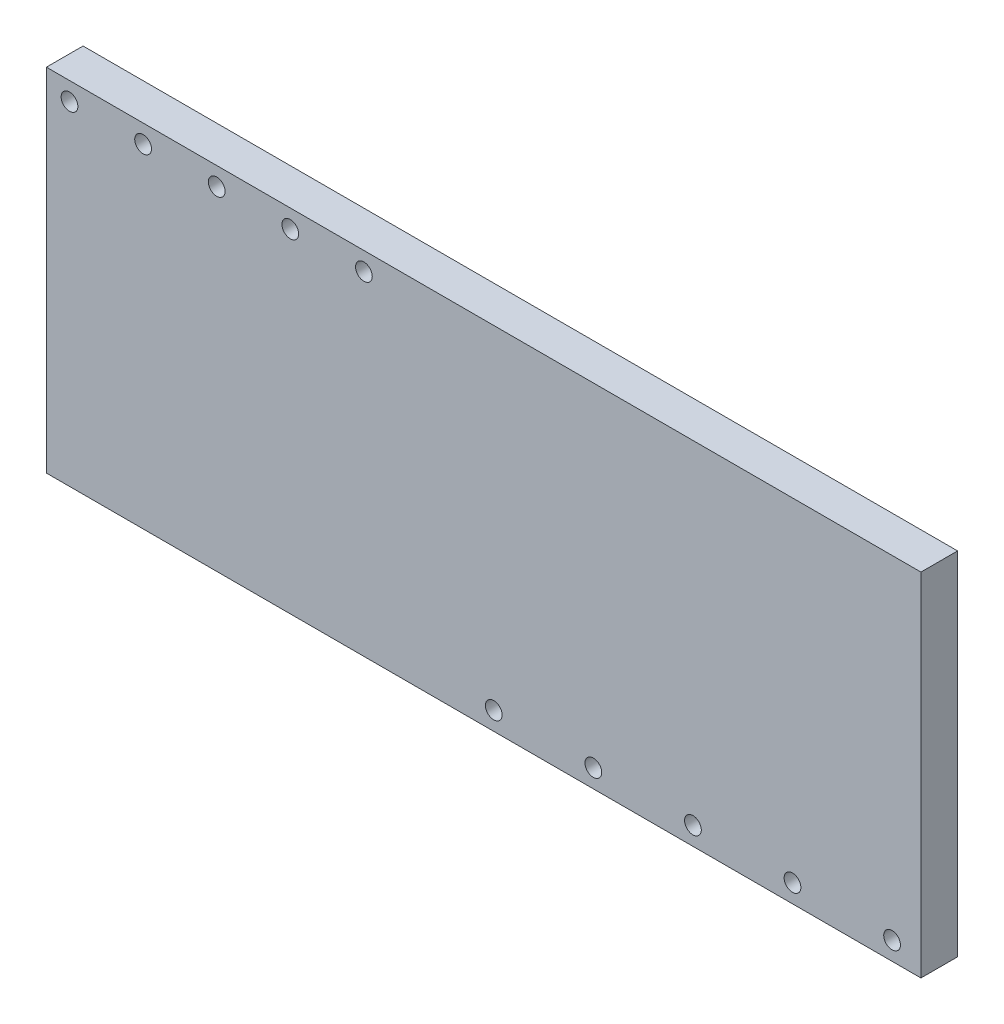
ISO-10303-21;
HEADER;
FILE_DESCRIPTION(('STEP AP214'),'2;1');
FILE_NAME('part.step','',(''),(''),'','','');
FILE_SCHEMA(('AUTOMOTIVE_DESIGN { 1 0 10303 214 1 1 1 1 }'));
ENDSEC;
DATA;
#1=APPLICATION_CONTEXT('core data for automotive mechanical design processes');
#2=APPLICATION_PROTOCOL_DEFINITION('international standard','automotive_design',2000,#1);
#3=PRODUCT_CONTEXT('',#1,'mechanical');
#4=PRODUCT('Part','Part','',(#3));
#5=PRODUCT_RELATED_PRODUCT_CATEGORY('part','',(#4));
#6=PRODUCT_DEFINITION_FORMATION('','',#4);
#7=PRODUCT_DEFINITION_CONTEXT('part definition',#1,'design');
#8=PRODUCT_DEFINITION('design','',#6,#7);
#9=PRODUCT_DEFINITION_SHAPE('','',#8);
#10=(LENGTH_UNIT() NAMED_UNIT(*) SI_UNIT(.MILLI.,.METRE.));
#11=(NAMED_UNIT(*) PLANE_ANGLE_UNIT() SI_UNIT($,.RADIAN.));
#12=(NAMED_UNIT(*) SI_UNIT($,.STERADIAN.) SOLID_ANGLE_UNIT());
#13=UNCERTAINTY_MEASURE_WITH_UNIT(LENGTH_MEASURE(1.E-05),#10,'distance_accuracy_value','');
#14=(GEOMETRIC_REPRESENTATION_CONTEXT(3) GLOBAL_UNCERTAINTY_ASSIGNED_CONTEXT((#13)) GLOBAL_UNIT_ASSIGNED_CONTEXT((#10,
#11,#12)) REPRESENTATION_CONTEXT('',''));
#15=CARTESIAN_POINT('',(0.,0.,0.));
#16=DIRECTION('',(0.,0.,1.));
#17=DIRECTION('',(1.,0.,0.));
#18=AXIS2_PLACEMENT_3D('',#15,#16,#17);
#19=CARTESIAN_POINT('',(75.750000011,30.45,6.35));
#20=DIRECTION('',(-1.,0.,0.));
#21=DIRECTION('',(0.,-1.,0.));
#22=AXIS2_PLACEMENT_3D('',#19,#20,#21);
#23=PLANE('',#22);
#24=DIRECTION('',(0.,1.,0.));
#25=VECTOR('',#24,1.);
#26=CARTESIAN_POINT('',(75.750000011,30.45,0.));
#27=LINE('',#26,#25);
#28=CARTESIAN_POINT('',(75.750000011,-30.45,0.));
#29=VERTEX_POINT('',#28);
#30=CARTESIAN_POINT('',(75.750000011,30.45,0.));
#31=VERTEX_POINT('',#30);
#32=EDGE_CURVE('E97',#29,#31,#27,.T.);
#33=ORIENTED_EDGE('',*,*,#32,.T.);
#34=DIRECTION('',(0.,0.,-1.));
#35=VECTOR('',#34,1.);
#36=CARTESIAN_POINT('',(75.750000011,30.45,6.35));
#37=LINE('',#36,#35);
#38=CARTESIAN_POINT('',(75.750000011,30.45,6.35));
#39=VERTEX_POINT('',#38);
#40=EDGE_CURVE('E11',#39,#31,#37,.T.);
#41=ORIENTED_EDGE('',*,*,#40,.F.);
#42=DIRECTION('',(0.,1.,0.));
#43=VECTOR('',#42,1.);
#44=CARTESIAN_POINT('',(75.750000011,30.45,6.35));
#45=LINE('',#44,#43);
#46=CARTESIAN_POINT('',(75.750000011,-30.45,6.35));
#47=VERTEX_POINT('',#46);
#48=EDGE_CURVE('E85',#47,#39,#45,.T.);
#49=ORIENTED_EDGE('',*,*,#48,.F.);
#50=DIRECTION('',(0.,0.,-1.));
#51=VECTOR('',#50,1.);
#52=CARTESIAN_POINT('',(75.750000011,-30.45,6.35));
#53=LINE('',#52,#51);
#54=EDGE_CURVE('E93',#47,#29,#53,.T.);
#55=ORIENTED_EDGE('',*,*,#54,.T.);
#56=EDGE_LOOP('',(#33,#41,#49,#55));
#57=FACE_BOUND('',#56,.T.);
#58=ADVANCED_FACE('F34',(#57),#23,.F.);
#59=CARTESIAN_POINT('',(-75.750000011,30.45,6.35));
#60=DIRECTION('',(0.,-1.,0.));
#61=DIRECTION('',(0.,0.,-1.));
#62=AXIS2_PLACEMENT_3D('',#59,#60,#61);
#63=PLANE('',#62);
#64=DIRECTION('',(-1.,0.,0.));
#65=VECTOR('',#64,1.);
#66=CARTESIAN_POINT('',(-75.750000011,30.45,0.));
#67=LINE('',#66,#65);
#68=CARTESIAN_POINT('',(-75.750000011,30.45,0.));
#69=VERTEX_POINT('',#68);
#70=EDGE_CURVE('E89',#31,#69,#67,.T.);
#71=ORIENTED_EDGE('',*,*,#70,.T.);
#72=DIRECTION('',(0.,0.,-1.));
#73=VECTOR('',#72,1.);
#74=CARTESIAN_POINT('',(-75.750000011,30.45,6.35));
#75=LINE('',#74,#73);
#76=CARTESIAN_POINT('',(-75.750000011,30.45,6.35));
#77=VERTEX_POINT('',#76);
#78=EDGE_CURVE('E42',#77,#69,#75,.T.);
#79=ORIENTED_EDGE('',*,*,#78,.F.);
#80=DIRECTION('',(-1.,0.,0.));
#81=VECTOR('',#80,1.);
#82=CARTESIAN_POINT('',(-75.750000011,30.45,6.35));
#83=LINE('',#82,#81);
#84=EDGE_CURVE('E80',#39,#77,#83,.T.);
#85=ORIENTED_EDGE('',*,*,#84,.F.);
#86=ORIENTED_EDGE('',*,*,#40,.T.);
#87=EDGE_LOOP('',(#71,#79,#85,#86));
#88=FACE_BOUND('',#87,.T.);
#89=ADVANCED_FACE('F88',(#88),#63,.F.);
#90=CARTESIAN_POINT('',(-75.750000011,30.45,6.35));
#91=DIRECTION('',(1.,0.,0.));
#92=DIRECTION('',(0.,1.,0.));
#93=AXIS2_PLACEMENT_3D('',#90,#91,#92);
#94=PLANE('',#93);
#95=DIRECTION('',(0.,-1.,0.));
#96=VECTOR('',#95,1.);
#97=CARTESIAN_POINT('',(-75.750000011,30.45,0.));
#98=LINE('',#97,#96);
#99=CARTESIAN_POINT('',(-75.750000011,-30.45,0.));
#100=VERTEX_POINT('',#99);
#101=EDGE_CURVE('E67',#69,#100,#98,.T.);
#102=ORIENTED_EDGE('',*,*,#101,.T.);
#103=DIRECTION('',(0.,0.,-1.));
#104=VECTOR('',#103,1.);
#105=CARTESIAN_POINT('',(-75.750000011,-30.45,6.35));
#106=LINE('',#105,#104);
#107=CARTESIAN_POINT('',(-75.750000011,-30.45,6.35));
#108=VERTEX_POINT('',#107);
#109=EDGE_CURVE('E90',#108,#100,#106,.T.);
#110=ORIENTED_EDGE('',*,*,#109,.F.);
#111=DIRECTION('',(0.,-1.,0.));
#112=VECTOR('',#111,1.);
#113=CARTESIAN_POINT('',(-75.750000011,30.45,6.35));
#114=LINE('',#113,#112);
#115=EDGE_CURVE('E83',#77,#108,#114,.T.);
#116=ORIENTED_EDGE('',*,*,#115,.F.);
#117=ORIENTED_EDGE('',*,*,#78,.T.);
#118=EDGE_LOOP('',(#102,#110,#116,#117));
#119=FACE_BOUND('',#118,.T.);
#120=ADVANCED_FACE('F91',(#119),#94,.F.);
#121=CARTESIAN_POINT('',(-75.750000011,-30.45,6.35));
#122=DIRECTION('',(0.,1.,0.));
#123=DIRECTION('',(0.,0.,1.));
#124=AXIS2_PLACEMENT_3D('',#121,#122,#123);
#125=PLANE('',#124);
#126=DIRECTION('',(1.,0.,0.));
#127=VECTOR('',#126,1.);
#128=CARTESIAN_POINT('',(-75.750000011,-30.45,0.));
#129=LINE('',#128,#127);
#130=EDGE_CURVE('E73',#100,#29,#129,.T.);
#131=ORIENTED_EDGE('',*,*,#130,.T.);
#132=ORIENTED_EDGE('',*,*,#54,.F.);
#133=DIRECTION('',(1.,0.,0.));
#134=VECTOR('',#133,1.);
#135=CARTESIAN_POINT('',(-75.750000011,-30.45,6.35));
#136=LINE('',#135,#134);
#137=EDGE_CURVE('E50',#108,#47,#136,.T.);
#138=ORIENTED_EDGE('',*,*,#137,.F.);
#139=ORIENTED_EDGE('',*,*,#109,.T.);
#140=EDGE_LOOP('',(#131,#132,#138,#139));
#141=FACE_BOUND('',#140,.T.);
#142=ADVANCED_FACE('F105',(#141),#125,.F.);
#143=CARTESIAN_POINT('',(0.,0.,6.35));
#144=DIRECTION('',(0.,0.,1.));
#145=DIRECTION('',(1.,0.,0.));
#146=AXIS2_PLACEMENT_3D('',#143,#144,#145);
#147=PLANE('',#146);
#148=CARTESIAN_POINT('',(-71.750000011,27.275,6.35));
#149=DIRECTION('',(0.,0.,1.));
#150=DIRECTION('',(1.,0.,0.));
#151=AXIS2_PLACEMENT_3D('',#148,#149,#150);
#152=CIRCLE('',#151,1.44999999999999);
#153=CARTESIAN_POINT('',(-70.300000011,27.275,6.35));
#154=VERTEX_POINT('',#153);
#155=EDGE_CURVE('E167',#154,#154,#152,.T.);
#156=ORIENTED_EDGE('',*,*,#155,.F.);
#157=EDGE_LOOP('',(#156));
#158=FACE_BOUND('',#157,.T.);
#159=CARTESIAN_POINT('',(-59.000000011,27.275,6.35));
#160=DIRECTION('',(0.,0.,1.));
#161=DIRECTION('',(1.,0.,0.));
#162=AXIS2_PLACEMENT_3D('',#159,#160,#161);
#163=CIRCLE('',#162,1.45);
#164=CARTESIAN_POINT('',(-57.550000011,27.275,6.35));
#165=VERTEX_POINT('',#164);
#166=EDGE_CURVE('E161',#165,#165,#163,.T.);
#167=ORIENTED_EDGE('',*,*,#166,.F.);
#168=EDGE_LOOP('',(#167));
#169=FACE_BOUND('',#168,.T.);
#170=CARTESIAN_POINT('',(-46.250000011,27.275,6.35));
#171=DIRECTION('',(0.,0.,1.));
#172=DIRECTION('',(1.,0.,0.));
#173=AXIS2_PLACEMENT_3D('',#170,#171,#172);
#174=CIRCLE('',#173,1.45);
#175=CARTESIAN_POINT('',(-44.800000011,27.275,6.35));
#176=VERTEX_POINT('',#175);
#177=EDGE_CURVE('E155',#176,#176,#174,.T.);
#178=ORIENTED_EDGE('',*,*,#177,.F.);
#179=EDGE_LOOP('',(#178));
#180=FACE_BOUND('',#179,.T.);
#181=CARTESIAN_POINT('',(-33.500000011,27.275,6.35));
#182=DIRECTION('',(0.,0.,1.));
#183=DIRECTION('',(1.,0.,0.));
#184=AXIS2_PLACEMENT_3D('',#181,#182,#183);
#185=CIRCLE('',#184,1.45);
#186=CARTESIAN_POINT('',(-32.050000011,27.275,6.35));
#187=VERTEX_POINT('',#186);
#188=EDGE_CURVE('E149',#187,#187,#185,.T.);
#189=ORIENTED_EDGE('',*,*,#188,.F.);
#190=EDGE_LOOP('',(#189));
#191=FACE_BOUND('',#190,.T.);
#192=CARTESIAN_POINT('',(-20.750000011,27.275,6.35));
#193=DIRECTION('',(0.,0.,1.));
#194=DIRECTION('',(1.,0.,0.));
#195=AXIS2_PLACEMENT_3D('',#192,#193,#194);
#196=CIRCLE('',#195,1.45);
#197=CARTESIAN_POINT('',(-19.300000011,27.275,6.35));
#198=VERTEX_POINT('',#197);
#199=EDGE_CURVE('E143',#198,#198,#196,.T.);
#200=ORIENTED_EDGE('',*,*,#199,.F.);
#201=EDGE_LOOP('',(#200));
#202=FACE_BOUND('',#201,.T.);
#203=CARTESIAN_POINT('',(1.75000115605144,-27.2749999999997,6.35));
#204=DIRECTION('',(0.,0.,1.));
#205=DIRECTION('',(1.,0.,0.));
#206=AXIS2_PLACEMENT_3D('',#203,#204,#205);
#207=CIRCLE('',#206,1.45);
#208=CARTESIAN_POINT('',(3.20000115605144,-27.2749999999997,6.35));
#209=VERTEX_POINT('',#208);
#210=EDGE_CURVE('E137',#209,#209,#207,.T.);
#211=ORIENTED_EDGE('',*,*,#210,.F.);
#212=EDGE_LOOP('',(#211));
#213=FACE_BOUND('',#212,.T.);
#214=CARTESIAN_POINT('',(19.000000864289,-27.2749999999997,6.35));
#215=DIRECTION('',(0.,0.,1.));
#216=DIRECTION('',(1.,0.,0.));
#217=AXIS2_PLACEMENT_3D('',#214,#215,#216);
#218=CIRCLE('',#217,1.45);
#219=CARTESIAN_POINT('',(20.450000864289,-27.2749999999997,6.35));
#220=VERTEX_POINT('',#219);
#221=EDGE_CURVE('E131',#220,#220,#218,.T.);
#222=ORIENTED_EDGE('',*,*,#221,.F.);
#223=EDGE_LOOP('',(#222));
#224=FACE_BOUND('',#223,.T.);
#225=CARTESIAN_POINT('',(36.2500005725266,-27.2749999999997,6.35));
#226=DIRECTION('',(0.,0.,1.));
#227=DIRECTION('',(1.,0.,0.));
#228=AXIS2_PLACEMENT_3D('',#225,#226,#227);
#229=CIRCLE('',#228,1.45);
#230=CARTESIAN_POINT('',(37.7000005725266,-27.2749999999997,6.35));
#231=VERTEX_POINT('',#230);
#232=EDGE_CURVE('E125',#231,#231,#229,.T.);
#233=ORIENTED_EDGE('',*,*,#232,.F.);
#234=EDGE_LOOP('',(#233));
#235=FACE_BOUND('',#234,.T.);
#236=CARTESIAN_POINT('',(53.5000002807642,-27.2749999999997,6.35));
#237=DIRECTION('',(0.,0.,1.));
#238=DIRECTION('',(1.,0.,0.));
#239=AXIS2_PLACEMENT_3D('',#236,#237,#238);
#240=CIRCLE('',#239,1.45);
#241=CARTESIAN_POINT('',(54.9500002807642,-27.2749999999997,6.35));
#242=VERTEX_POINT('',#241);
#243=EDGE_CURVE('E119',#242,#242,#240,.T.);
#244=ORIENTED_EDGE('',*,*,#243,.F.);
#245=EDGE_LOOP('',(#244));
#246=FACE_BOUND('',#245,.T.);
#247=CARTESIAN_POINT('',(70.7499999890018,-27.2749999999997,6.35));
#248=DIRECTION('',(0.,0.,1.));
#249=DIRECTION('',(1.,0.,0.));
#250=AXIS2_PLACEMENT_3D('',#247,#248,#249);
#251=CIRCLE('',#250,1.44999999999999);
#252=CARTESIAN_POINT('',(72.1999999890018,-27.2749999999997,6.35));
#253=VERTEX_POINT('',#252);
#254=EDGE_CURVE('E113',#253,#253,#251,.T.);
#255=ORIENTED_EDGE('',*,*,#254,.F.);
#256=EDGE_LOOP('',(#255));
#257=FACE_BOUND('',#256,.T.);
#258=ORIENTED_EDGE('',*,*,#48,.T.);
#259=ORIENTED_EDGE('',*,*,#84,.T.);
#260=ORIENTED_EDGE('',*,*,#115,.T.);
#261=ORIENTED_EDGE('',*,*,#137,.T.);
#262=EDGE_LOOP('',(#258,#259,#260,#261));
#263=FACE_BOUND('',#262,.T.);
#264=ADVANCED_FACE('F81',(#158,#169,#180,#191,#202,#213,#224,#235,#246,#257,#263),#147,.T.);
#265=CARTESIAN_POINT('',(0.,0.,0.));
#266=DIRECTION('',(0.,0.,1.));
#267=DIRECTION('',(1.,0.,0.));
#268=AXIS2_PLACEMENT_3D('',#265,#266,#267);
#269=PLANE('',#268);
#270=CARTESIAN_POINT('',(-71.750000011,27.275,0.));
#271=DIRECTION('',(0.,0.,1.));
#272=DIRECTION('',(1.,0.,0.));
#273=AXIS2_PLACEMENT_3D('',#270,#271,#272);
#274=CIRCLE('',#273,1.44999999999999);
#275=CARTESIAN_POINT('',(-70.300000011,27.275,0.));
#276=VERTEX_POINT('',#275);
#277=EDGE_CURVE('E164',#276,#276,#274,.T.);
#278=ORIENTED_EDGE('',*,*,#277,.T.);
#279=EDGE_LOOP('',(#278));
#280=FACE_BOUND('',#279,.T.);
#281=CARTESIAN_POINT('',(-59.000000011,27.275,0.));
#282=DIRECTION('',(0.,0.,1.));
#283=DIRECTION('',(1.,0.,0.));
#284=AXIS2_PLACEMENT_3D('',#281,#282,#283);
#285=CIRCLE('',#284,1.45);
#286=CARTESIAN_POINT('',(-57.550000011,27.275,0.));
#287=VERTEX_POINT('',#286);
#288=EDGE_CURVE('E158',#287,#287,#285,.T.);
#289=ORIENTED_EDGE('',*,*,#288,.T.);
#290=EDGE_LOOP('',(#289));
#291=FACE_BOUND('',#290,.T.);
#292=CARTESIAN_POINT('',(-46.250000011,27.275,0.));
#293=DIRECTION('',(0.,0.,1.));
#294=DIRECTION('',(1.,0.,0.));
#295=AXIS2_PLACEMENT_3D('',#292,#293,#294);
#296=CIRCLE('',#295,1.45);
#297=CARTESIAN_POINT('',(-44.800000011,27.275,0.));
#298=VERTEX_POINT('',#297);
#299=EDGE_CURVE('E152',#298,#298,#296,.T.);
#300=ORIENTED_EDGE('',*,*,#299,.T.);
#301=EDGE_LOOP('',(#300));
#302=FACE_BOUND('',#301,.T.);
#303=CARTESIAN_POINT('',(-33.500000011,27.275,0.));
#304=DIRECTION('',(0.,0.,1.));
#305=DIRECTION('',(1.,0.,0.));
#306=AXIS2_PLACEMENT_3D('',#303,#304,#305);
#307=CIRCLE('',#306,1.45);
#308=CARTESIAN_POINT('',(-32.050000011,27.275,0.));
#309=VERTEX_POINT('',#308);
#310=EDGE_CURVE('E146',#309,#309,#307,.T.);
#311=ORIENTED_EDGE('',*,*,#310,.T.);
#312=EDGE_LOOP('',(#311));
#313=FACE_BOUND('',#312,.T.);
#314=CARTESIAN_POINT('',(-20.750000011,27.275,0.));
#315=DIRECTION('',(0.,0.,1.));
#316=DIRECTION('',(1.,0.,0.));
#317=AXIS2_PLACEMENT_3D('',#314,#315,#316);
#318=CIRCLE('',#317,1.45);
#319=CARTESIAN_POINT('',(-19.300000011,27.275,0.));
#320=VERTEX_POINT('',#319);
#321=EDGE_CURVE('E140',#320,#320,#318,.T.);
#322=ORIENTED_EDGE('',*,*,#321,.T.);
#323=EDGE_LOOP('',(#322));
#324=FACE_BOUND('',#323,.T.);
#325=CARTESIAN_POINT('',(1.75000115605144,-27.2749999999997,0.));
#326=DIRECTION('',(0.,0.,1.));
#327=DIRECTION('',(1.,0.,0.));
#328=AXIS2_PLACEMENT_3D('',#325,#326,#327);
#329=CIRCLE('',#328,1.45);
#330=CARTESIAN_POINT('',(3.20000115605144,-27.2749999999997,0.));
#331=VERTEX_POINT('',#330);
#332=EDGE_CURVE('E134',#331,#331,#329,.T.);
#333=ORIENTED_EDGE('',*,*,#332,.T.);
#334=EDGE_LOOP('',(#333));
#335=FACE_BOUND('',#334,.T.);
#336=CARTESIAN_POINT('',(19.000000864289,-27.2749999999997,0.));
#337=DIRECTION('',(0.,0.,1.));
#338=DIRECTION('',(1.,0.,0.));
#339=AXIS2_PLACEMENT_3D('',#336,#337,#338);
#340=CIRCLE('',#339,1.45);
#341=CARTESIAN_POINT('',(20.450000864289,-27.2749999999997,0.));
#342=VERTEX_POINT('',#341);
#343=EDGE_CURVE('E128',#342,#342,#340,.T.);
#344=ORIENTED_EDGE('',*,*,#343,.T.);
#345=EDGE_LOOP('',(#344));
#346=FACE_BOUND('',#345,.T.);
#347=CARTESIAN_POINT('',(36.2500005725266,-27.2749999999997,0.));
#348=DIRECTION('',(0.,0.,1.));
#349=DIRECTION('',(1.,0.,0.));
#350=AXIS2_PLACEMENT_3D('',#347,#348,#349);
#351=CIRCLE('',#350,1.45);
#352=CARTESIAN_POINT('',(37.7000005725266,-27.2749999999997,0.));
#353=VERTEX_POINT('',#352);
#354=EDGE_CURVE('E122',#353,#353,#351,.T.);
#355=ORIENTED_EDGE('',*,*,#354,.T.);
#356=EDGE_LOOP('',(#355));
#357=FACE_BOUND('',#356,.T.);
#358=CARTESIAN_POINT('',(53.5000002807642,-27.2749999999997,0.));
#359=DIRECTION('',(0.,0.,1.));
#360=DIRECTION('',(1.,0.,0.));
#361=AXIS2_PLACEMENT_3D('',#358,#359,#360);
#362=CIRCLE('',#361,1.45);
#363=CARTESIAN_POINT('',(54.9500002807642,-27.2749999999997,0.));
#364=VERTEX_POINT('',#363);
#365=EDGE_CURVE('E116',#364,#364,#362,.T.);
#366=ORIENTED_EDGE('',*,*,#365,.T.);
#367=EDGE_LOOP('',(#366));
#368=FACE_BOUND('',#367,.T.);
#369=CARTESIAN_POINT('',(70.7499999890018,-27.2749999999997,0.));
#370=DIRECTION('',(0.,0.,1.));
#371=DIRECTION('',(1.,0.,0.));
#372=AXIS2_PLACEMENT_3D('',#369,#370,#371);
#373=CIRCLE('',#372,1.44999999999999);
#374=CARTESIAN_POINT('',(72.1999999890018,-27.2749999999997,0.));
#375=VERTEX_POINT('',#374);
#376=EDGE_CURVE('E100',#375,#375,#373,.T.);
#377=ORIENTED_EDGE('',*,*,#376,.T.);
#378=EDGE_LOOP('',(#377));
#379=FACE_BOUND('',#378,.T.);
#380=ORIENTED_EDGE('',*,*,#32,.F.);
#381=ORIENTED_EDGE('',*,*,#130,.F.);
#382=ORIENTED_EDGE('',*,*,#101,.F.);
#383=ORIENTED_EDGE('',*,*,#70,.F.);
#384=EDGE_LOOP('',(#380,#381,#382,#383));
#385=FACE_BOUND('',#384,.T.);
#386=ADVANCED_FACE('F108',(#280,#291,#302,#313,#324,#335,#346,#357,#368,#379,#385),#269,.F.);
#387=CARTESIAN_POINT('',(70.7499999890018,-27.2749999999997,6.35));
#388=DIRECTION('',(0.,0.,1.));
#389=DIRECTION('',(1.,0.,0.));
#390=AXIS2_PLACEMENT_3D('',#387,#388,#389);
#391=CYLINDRICAL_SURFACE('',#390,1.44999999999999);
#392=ORIENTED_EDGE('',*,*,#376,.F.);
#393=EDGE_LOOP('',(#392));
#394=FACE_BOUND('',#393,.T.);
#395=ORIENTED_EDGE('',*,*,#254,.T.);
#396=EDGE_LOOP('',(#395));
#397=FACE_BOUND('',#396,.T.);
#398=ADVANCED_FACE('F194',(#394,#397),#391,.F.);
#399=CARTESIAN_POINT('',(53.5000002807642,-27.2749999999997,6.35));
#400=DIRECTION('',(0.,0.,1.));
#401=DIRECTION('',(1.,0.,0.));
#402=AXIS2_PLACEMENT_3D('',#399,#400,#401);
#403=CYLINDRICAL_SURFACE('',#402,1.45);
#404=ORIENTED_EDGE('',*,*,#365,.F.);
#405=EDGE_LOOP('',(#404));
#406=FACE_BOUND('',#405,.T.);
#407=ORIENTED_EDGE('',*,*,#243,.T.);
#408=EDGE_LOOP('',(#407));
#409=FACE_BOUND('',#408,.T.);
#410=ADVANCED_FACE('F196',(#406,#409),#403,.F.);
#411=CARTESIAN_POINT('',(36.2500005725266,-27.2749999999997,6.35));
#412=DIRECTION('',(0.,0.,1.));
#413=DIRECTION('',(1.,0.,0.));
#414=AXIS2_PLACEMENT_3D('',#411,#412,#413);
#415=CYLINDRICAL_SURFACE('',#414,1.45);
#416=ORIENTED_EDGE('',*,*,#354,.F.);
#417=EDGE_LOOP('',(#416));
#418=FACE_BOUND('',#417,.T.);
#419=ORIENTED_EDGE('',*,*,#232,.T.);
#420=EDGE_LOOP('',(#419));
#421=FACE_BOUND('',#420,.T.);
#422=ADVANCED_FACE('F203',(#418,#421),#415,.F.);
#423=CARTESIAN_POINT('',(19.000000864289,-27.2749999999997,6.35));
#424=DIRECTION('',(0.,0.,1.));
#425=DIRECTION('',(1.,0.,0.));
#426=AXIS2_PLACEMENT_3D('',#423,#424,#425);
#427=CYLINDRICAL_SURFACE('',#426,1.45);
#428=ORIENTED_EDGE('',*,*,#343,.F.);
#429=EDGE_LOOP('',(#428));
#430=FACE_BOUND('',#429,.T.);
#431=ORIENTED_EDGE('',*,*,#221,.T.);
#432=EDGE_LOOP('',(#431));
#433=FACE_BOUND('',#432,.T.);
#434=ADVANCED_FACE('F250',(#430,#433),#427,.F.);
#435=CARTESIAN_POINT('',(1.75000115605144,-27.2749999999997,6.35));
#436=DIRECTION('',(0.,0.,1.));
#437=DIRECTION('',(1.,0.,0.));
#438=AXIS2_PLACEMENT_3D('',#435,#436,#437);
#439=CYLINDRICAL_SURFACE('',#438,1.45);
#440=ORIENTED_EDGE('',*,*,#332,.F.);
#441=EDGE_LOOP('',(#440));
#442=FACE_BOUND('',#441,.T.);
#443=ORIENTED_EDGE('',*,*,#210,.T.);
#444=EDGE_LOOP('',(#443));
#445=FACE_BOUND('',#444,.T.);
#446=ADVANCED_FACE('F260',(#442,#445),#439,.F.);
#447=CARTESIAN_POINT('',(-20.750000011,27.275,6.35));
#448=DIRECTION('',(0.,0.,1.));
#449=DIRECTION('',(1.,0.,0.));
#450=AXIS2_PLACEMENT_3D('',#447,#448,#449);
#451=CYLINDRICAL_SURFACE('',#450,1.45);
#452=ORIENTED_EDGE('',*,*,#321,.F.);
#453=EDGE_LOOP('',(#452));
#454=FACE_BOUND('',#453,.T.);
#455=ORIENTED_EDGE('',*,*,#199,.T.);
#456=EDGE_LOOP('',(#455));
#457=FACE_BOUND('',#456,.T.);
#458=ADVANCED_FACE('F270',(#454,#457),#451,.F.);
#459=CARTESIAN_POINT('',(-33.500000011,27.275,6.35));
#460=DIRECTION('',(0.,0.,1.));
#461=DIRECTION('',(1.,0.,0.));
#462=AXIS2_PLACEMENT_3D('',#459,#460,#461);
#463=CYLINDRICAL_SURFACE('',#462,1.45);
#464=ORIENTED_EDGE('',*,*,#310,.F.);
#465=EDGE_LOOP('',(#464));
#466=FACE_BOUND('',#465,.T.);
#467=ORIENTED_EDGE('',*,*,#188,.T.);
#468=EDGE_LOOP('',(#467));
#469=FACE_BOUND('',#468,.T.);
#470=ADVANCED_FACE('F280',(#466,#469),#463,.F.);
#471=CARTESIAN_POINT('',(-46.250000011,27.275,6.35));
#472=DIRECTION('',(0.,0.,1.));
#473=DIRECTION('',(1.,0.,0.));
#474=AXIS2_PLACEMENT_3D('',#471,#472,#473);
#475=CYLINDRICAL_SURFACE('',#474,1.45);
#476=ORIENTED_EDGE('',*,*,#299,.F.);
#477=EDGE_LOOP('',(#476));
#478=FACE_BOUND('',#477,.T.);
#479=ORIENTED_EDGE('',*,*,#177,.T.);
#480=EDGE_LOOP('',(#479));
#481=FACE_BOUND('',#480,.T.);
#482=ADVANCED_FACE('F290',(#478,#481),#475,.F.);
#483=CARTESIAN_POINT('',(-59.000000011,27.275,6.35));
#484=DIRECTION('',(0.,0.,1.));
#485=DIRECTION('',(1.,0.,0.));
#486=AXIS2_PLACEMENT_3D('',#483,#484,#485);
#487=CYLINDRICAL_SURFACE('',#486,1.45);
#488=ORIENTED_EDGE('',*,*,#288,.F.);
#489=EDGE_LOOP('',(#488));
#490=FACE_BOUND('',#489,.T.);
#491=ORIENTED_EDGE('',*,*,#166,.T.);
#492=EDGE_LOOP('',(#491));
#493=FACE_BOUND('',#492,.T.);
#494=ADVANCED_FACE('F300',(#490,#493),#487,.F.);
#495=CARTESIAN_POINT('',(-71.750000011,27.275,6.35));
#496=DIRECTION('',(0.,0.,1.));
#497=DIRECTION('',(1.,0.,0.));
#498=AXIS2_PLACEMENT_3D('',#495,#496,#497);
#499=CYLINDRICAL_SURFACE('',#498,1.44999999999999);
#500=ORIENTED_EDGE('',*,*,#277,.F.);
#501=EDGE_LOOP('',(#500));
#502=FACE_BOUND('',#501,.T.);
#503=ORIENTED_EDGE('',*,*,#155,.T.);
#504=EDGE_LOOP('',(#503));
#505=FACE_BOUND('',#504,.T.);
#506=ADVANCED_FACE('F171',(#502,#505),#499,.F.);
#507=CLOSED_SHELL('',(#58,#89,#120,#142,#264,#386,#398,#410,#422,#434,#446,#458,#470,#482,#494,#506));
#508=MANIFOLD_SOLID_BREP('B2',#507);
#509=ADVANCED_BREP_SHAPE_REPRESENTATION('',(#18,#508),#14);
#510=SHAPE_DEFINITION_REPRESENTATION(#9,#509);
ENDSEC;
END-ISO-10303-21;
